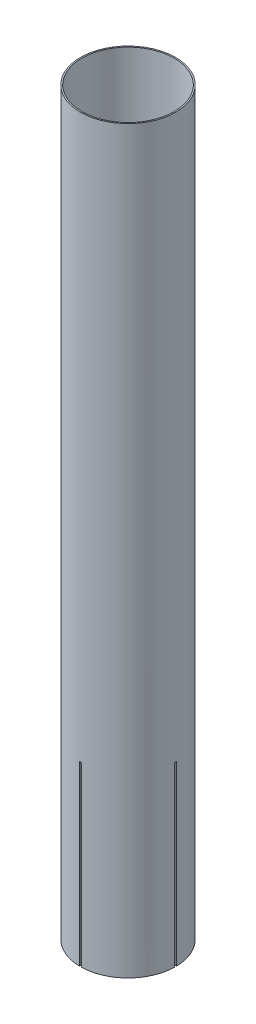
ISO-10303-21;
HEADER;
FILE_DESCRIPTION(('STEP AP214'),'2;1');
FILE_NAME('part.step','',(''),(''),'','','');
FILE_SCHEMA(('AUTOMOTIVE_DESIGN { 1 0 10303 214 1 1 1 1 }'));
ENDSEC;
DATA;
#1=APPLICATION_CONTEXT('core data for automotive mechanical design processes');
#2=APPLICATION_PROTOCOL_DEFINITION('international standard','automotive_design',2000,#1);
#3=PRODUCT_CONTEXT('',#1,'mechanical');
#4=PRODUCT('Part','Part','',(#3));
#5=PRODUCT_RELATED_PRODUCT_CATEGORY('part','',(#4));
#6=PRODUCT_DEFINITION_FORMATION('','',#4);
#7=PRODUCT_DEFINITION_CONTEXT('part definition',#1,'design');
#8=PRODUCT_DEFINITION('design','',#6,#7);
#9=PRODUCT_DEFINITION_SHAPE('','',#8);
#10=(LENGTH_UNIT() NAMED_UNIT(*) SI_UNIT(.MILLI.,.METRE.));
#11=(NAMED_UNIT(*) PLANE_ANGLE_UNIT() SI_UNIT($,.RADIAN.));
#12=(NAMED_UNIT(*) SI_UNIT($,.STERADIAN.) SOLID_ANGLE_UNIT());
#13=UNCERTAINTY_MEASURE_WITH_UNIT(LENGTH_MEASURE(1.E-05),#10,'distance_accuracy_value','');
#14=(GEOMETRIC_REPRESENTATION_CONTEXT(3) GLOBAL_UNCERTAINTY_ASSIGNED_CONTEXT((#13)) GLOBAL_UNIT_ASSIGNED_CONTEXT((#10,
#11,#12)) REPRESENTATION_CONTEXT('',''));
#15=CARTESIAN_POINT('',(0.,0.,0.));
#16=DIRECTION('',(0.,0.,1.));
#17=DIRECTION('',(1.,0.,0.));
#18=AXIS2_PLACEMENT_3D('',#15,#16,#17);
#19=CARTESIAN_POINT('',(0.,0.,0.));
#20=DIRECTION('',(0.,1.,0.));
#21=DIRECTION('',(0.,0.,1.));
#22=AXIS2_PLACEMENT_3D('',#19,#20,#21);
#23=PLANE('',#22);
#24=DIRECTION('',(1.,0.,0.));
#25=VECTOR('',#24,1.);
#26=CARTESIAN_POINT('',(-78.3590000000003,0.,-1.58750000000026));
#27=LINE('',#26,#25);
#28=CARTESIAN_POINT('',(-78.3429175149228,2.22044604925031E-13,-1.58750000000026));
#29=VERTEX_POINT('',#28);
#30=CARTESIAN_POINT('',(-76.1834617469566,2.22044604925031E-13,-1.58750000000025));
#31=VERTEX_POINT('',#30);
#32=EDGE_CURVE('E259',#29,#31,#27,.T.);
#33=ORIENTED_EDGE('',*,*,#32,.F.);
#34=CARTESIAN_POINT('',(0.,0.,0.));
#35=DIRECTION('',(0.,1.,0.));
#36=DIRECTION('',(0.,0.,1.));
#37=AXIS2_PLACEMENT_3D('',#34,#35,#36);
#38=CIRCLE('',#37,78.359);
#39=CARTESIAN_POINT('',(-1.58750000000002,0.,-78.3429175149228));
#40=VERTEX_POINT('',#39);
#41=EDGE_CURVE('E182',#40,#29,#38,.T.);
#42=ORIENTED_EDGE('',*,*,#41,.F.);
#43=DIRECTION('',(0.,0.,1.));
#44=VECTOR('',#43,1.);
#45=CARTESIAN_POINT('',(-1.58750000000002,0.,-78.359));
#46=LINE('',#45,#44);
#47=CARTESIAN_POINT('',(-1.58750000000002,0.,-76.1834617469566));
#48=VERTEX_POINT('',#47);
#49=EDGE_CURVE('E332',#40,#48,#46,.T.);
#50=ORIENTED_EDGE('',*,*,#49,.T.);
#51=CARTESIAN_POINT('',(0.,0.,0.));
#52=DIRECTION('',(0.,1.,0.));
#53=DIRECTION('',(0.,0.,1.));
#54=AXIS2_PLACEMENT_3D('',#51,#52,#53);
#55=CIRCLE('',#54,76.2);
#56=EDGE_CURVE('E322',#48,#31,#55,.T.);
#57=ORIENTED_EDGE('',*,*,#56,.T.);
#58=EDGE_LOOP('',(#33,#42,#50,#57));
#59=FACE_BOUND('',#58,.T.);
#60=ADVANCED_FACE('F41',(#59),#23,.F.);
#61=DIRECTION('',(1.,0.,0.));
#62=VECTOR('',#61,1.);
#63=CARTESIAN_POINT('',(-78.3590000000003,0.,1.58749999999974));
#64=LINE('',#63,#62);
#65=CARTESIAN_POINT('',(76.1834617469566,2.22044604925031E-13,1.58750000000028));
#66=VERTEX_POINT('',#65);
#67=CARTESIAN_POINT('',(78.3429175149228,2.22044604925031E-13,1.58750000000029));
#68=VERTEX_POINT('',#67);
#69=EDGE_CURVE('E249',#66,#68,#64,.T.);
#70=ORIENTED_EDGE('',*,*,#69,.T.);
#71=CARTESIAN_POINT('',(1.58750000000002,0.,78.3429175149228));
#72=VERTEX_POINT('',#71);
#73=EDGE_CURVE('E181',#72,#68,#38,.T.);
#74=ORIENTED_EDGE('',*,*,#73,.F.);
#75=DIRECTION('',(0.,0.,-1.));
#76=VECTOR('',#75,1.);
#77=CARTESIAN_POINT('',(1.58750000000002,0.,78.359));
#78=LINE('',#77,#76);
#79=CARTESIAN_POINT('',(1.58750000000002,0.,76.1834617469566));
#80=VERTEX_POINT('',#79);
#81=EDGE_CURVE('E285',#72,#80,#78,.T.);
#82=ORIENTED_EDGE('',*,*,#81,.T.);
#83=EDGE_CURVE('E315',#80,#66,#55,.T.);
#84=ORIENTED_EDGE('',*,*,#83,.T.);
#85=EDGE_LOOP('',(#70,#74,#82,#84));
#86=FACE_BOUND('',#85,.T.);
#87=ADVANCED_FACE('F374',(#86),#23,.F.);
#88=CARTESIAN_POINT('',(-78.3429175149228,2.22044604925031E-13,1.58749999999974));
#89=VERTEX_POINT('',#88);
#90=CARTESIAN_POINT('',(-76.1834617469566,2.22044604925031E-13,1.58749999999975));
#91=VERTEX_POINT('',#90);
#92=EDGE_CURVE('E254',#89,#91,#64,.T.);
#93=ORIENTED_EDGE('',*,*,#92,.T.);
#94=CARTESIAN_POINT('',(-1.58749999999998,0.,76.1834617469566));
#95=VERTEX_POINT('',#94);
#96=EDGE_CURVE('E311',#91,#95,#55,.T.);
#97=ORIENTED_EDGE('',*,*,#96,.T.);
#98=DIRECTION('',(0.,0.,-1.));
#99=VECTOR('',#98,1.);
#100=CARTESIAN_POINT('',(-1.58749999999998,0.,78.359));
#101=LINE('',#100,#99);
#102=CARTESIAN_POINT('',(-1.58749999999998,0.,78.3429175149228));
#103=VERTEX_POINT('',#102);
#104=EDGE_CURVE('E289',#103,#95,#101,.T.);
#105=ORIENTED_EDGE('',*,*,#104,.F.);
#106=EDGE_CURVE('E188',#89,#103,#38,.T.);
#107=ORIENTED_EDGE('',*,*,#106,.F.);
#108=EDGE_LOOP('',(#93,#97,#105,#107));
#109=FACE_BOUND('',#108,.T.);
#110=ADVANCED_FACE('F346',(#109),#23,.F.);
#111=DIRECTION('',(0.,0.,1.));
#112=VECTOR('',#111,1.);
#113=CARTESIAN_POINT('',(1.58749999999998,0.,-78.359));
#114=LINE('',#113,#112);
#115=CARTESIAN_POINT('',(1.58749999999998,0.,-78.3429175149228));
#116=VERTEX_POINT('',#115);
#117=CARTESIAN_POINT('',(1.58750000000036,0.,-76.1834617469566));
#118=VERTEX_POINT('',#117);
#119=EDGE_CURVE('E179',#116,#118,#114,.T.);
#120=ORIENTED_EDGE('',*,*,#119,.F.);
#121=CARTESIAN_POINT('',(78.3429175149228,0.,-1.5874999999992));
#122=VERTEX_POINT('',#121);
#123=EDGE_CURVE('E170',#122,#116,#38,.T.);
#124=ORIENTED_EDGE('',*,*,#123,.F.);
#125=DIRECTION('',(-1.,0.,0.));
#126=VECTOR('',#125,1.);
#127=CARTESIAN_POINT('',(78.3590000000008,0.,-1.5874999999992));
#128=LINE('',#127,#126);
#129=CARTESIAN_POINT('',(76.1834617469566,0.,-1.58749999999922));
#130=VERTEX_POINT('',#129);
#131=EDGE_CURVE('E153',#122,#130,#128,.T.);
#132=ORIENTED_EDGE('',*,*,#131,.T.);
#133=EDGE_CURVE('E318',#130,#118,#55,.T.);
#134=ORIENTED_EDGE('',*,*,#133,.T.);
#135=EDGE_LOOP('',(#120,#124,#132,#134));
#136=FACE_BOUND('',#135,.T.);
#137=ADVANCED_FACE('F178',(#136),#23,.F.);
#138=CARTESIAN_POINT('',(0.,1219.2,0.));
#139=DIRECTION('',(0.,-1.,0.));
#140=DIRECTION('',(0.,0.,-1.));
#141=AXIS2_PLACEMENT_3D('',#138,#139,#140);
#142=CYLINDRICAL_SURFACE('',#141,78.359);
#143=CARTESIAN_POINT('',(0.,1219.2,0.));
#144=DIRECTION('',(0.,1.,0.));
#145=DIRECTION('',(0.,0.,1.));
#146=AXIS2_PLACEMENT_3D('',#143,#144,#145);
#147=CIRCLE('',#146,78.359);
#148=CARTESIAN_POINT('',(0.,1219.2,78.359));
#149=VERTEX_POINT('',#148);
#150=EDGE_CURVE('E187',#149,#149,#147,.T.);
#151=ORIENTED_EDGE('',*,*,#150,.F.);
#152=EDGE_LOOP('',(#151));
#153=FACE_BOUND('',#152,.T.);
#154=DIRECTION('',(0.,-1.,0.));
#155=VECTOR('',#154,1.);
#156=CARTESIAN_POINT('',(-78.3429175149228,1219.2,1.58749999999937));
#157=LINE('',#156,#155);
#158=CARTESIAN_POINT('',(-78.3429175149228,292.1,1.58749999999965));
#159=VERTEX_POINT('',#158);
#160=EDGE_CURVE('E275',#89,#159,#157,.F.);
#161=ORIENTED_EDGE('',*,*,#160,.F.);
#162=ORIENTED_EDGE('',*,*,#106,.T.);
#163=DIRECTION('',(0.,-1.,0.));
#164=VECTOR('',#163,1.);
#165=CARTESIAN_POINT('',(-1.58750000000036,1219.2,78.3429175149228));
#166=LINE('',#165,#164);
#167=CARTESIAN_POINT('',(-1.58750000000007,292.1,78.3429175149228));
#168=VERTEX_POINT('',#167);
#169=EDGE_CURVE('E301',#168,#103,#166,.T.);
#170=ORIENTED_EDGE('',*,*,#169,.F.);
#171=CARTESIAN_POINT('',(0.,292.1,0.));
#172=DIRECTION('',(0.,-1.,0.));
#173=DIRECTION('',(0.,0.,-1.));
#174=AXIS2_PLACEMENT_3D('',#171,#172,#173);
#175=CIRCLE('',#174,78.359);
#176=CARTESIAN_POINT('',(1.58749999999993,292.1,78.3429175149228));
#177=VERTEX_POINT('',#176);
#178=EDGE_CURVE('E305',#177,#168,#175,.T.);
#179=ORIENTED_EDGE('',*,*,#178,.F.);
#180=DIRECTION('',(0.,-1.,0.));
#181=VECTOR('',#180,1.);
#182=CARTESIAN_POINT('',(1.58749999999964,1219.2,78.3429175149228));
#183=LINE('',#182,#181);
#184=EDGE_CURVE('E308',#72,#177,#183,.F.);
#185=ORIENTED_EDGE('',*,*,#184,.F.);
#186=ORIENTED_EDGE('',*,*,#73,.T.);
#187=DIRECTION('',(0.,-1.,0.));
#188=VECTOR('',#187,1.);
#189=CARTESIAN_POINT('',(78.3429175149228,1219.2,1.58749999999992));
#190=LINE('',#189,#188);
#191=CARTESIAN_POINT('',(78.3429175149228,292.1,1.5875000000002));
#192=VERTEX_POINT('',#191);
#193=EDGE_CURVE('E279',#192,#68,#190,.T.);
#194=ORIENTED_EDGE('',*,*,#193,.F.);
#195=CARTESIAN_POINT('',(0.,292.1,0.));
#196=DIRECTION('',(0.,-1.,0.));
#197=DIRECTION('',(0.,0.,-1.));
#198=AXIS2_PLACEMENT_3D('',#195,#196,#197);
#199=CIRCLE('',#198,78.359);
#200=CARTESIAN_POINT('',(78.3429175149228,292.1,-1.58749999999911));
#201=VERTEX_POINT('',#200);
#202=EDGE_CURVE('E172',#201,#192,#199,.T.);
#203=ORIENTED_EDGE('',*,*,#202,.F.);
#204=DIRECTION('',(0.,-1.,0.));
#205=VECTOR('',#204,1.);
#206=CARTESIAN_POINT('',(78.3429175149228,1219.2,-1.58749999999882));
#207=LINE('',#206,#205);
#208=EDGE_CURVE('E156',#122,#201,#207,.F.);
#209=ORIENTED_EDGE('',*,*,#208,.F.);
#210=ORIENTED_EDGE('',*,*,#123,.T.);
#211=DIRECTION('',(0.,-1.,0.));
#212=VECTOR('',#211,1.);
#213=CARTESIAN_POINT('',(1.58750000000036,1219.2,-78.3429175149228));
#214=LINE('',#213,#212);
#215=CARTESIAN_POINT('',(1.58750000000007,292.1,-78.3429175149228));
#216=VERTEX_POINT('',#215);
#217=EDGE_CURVE('E174',#216,#116,#214,.T.);
#218=ORIENTED_EDGE('',*,*,#217,.F.);
#219=CARTESIAN_POINT('',(-1.58749999999993,292.1,-78.3429175149228));
#220=VERTEX_POINT('',#219);
#221=EDGE_CURVE('E272',#220,#216,#199,.T.);
#222=ORIENTED_EDGE('',*,*,#221,.F.);
#223=DIRECTION('',(0.,-1.,0.));
#224=VECTOR('',#223,1.);
#225=CARTESIAN_POINT('',(-1.58749999999964,1219.2,-78.3429175149228));
#226=LINE('',#225,#224);
#227=EDGE_CURVE('E247',#40,#220,#226,.F.);
#228=ORIENTED_EDGE('',*,*,#227,.F.);
#229=ORIENTED_EDGE('',*,*,#41,.T.);
#230=DIRECTION('',(0.,-1.,0.));
#231=VECTOR('',#230,1.);
#232=CARTESIAN_POINT('',(-78.3429175149228,1219.2,-1.58750000000063));
#233=LINE('',#232,#231);
#234=CARTESIAN_POINT('',(-78.3429175149228,292.1,-1.58750000000034));
#235=VERTEX_POINT('',#234);
#236=EDGE_CURVE('E282',#235,#29,#233,.T.);
#237=ORIENTED_EDGE('',*,*,#236,.F.);
#238=EDGE_CURVE('E276',#159,#235,#199,.T.);
#239=ORIENTED_EDGE('',*,*,#238,.F.);
#240=EDGE_LOOP('',(#161,#162,#170,#179,#185,#186,#194,#203,#209,#210,#218,#222,#228,#229,#237,#239));
#241=FACE_BOUND('',#240,.T.);
#242=ADVANCED_FACE('F43',(#153,#241),#142,.T.);
#243=CARTESIAN_POINT('',(0.,1219.2,0.));
#244=DIRECTION('',(0.,-1.,0.));
#245=DIRECTION('',(0.,0.,-1.));
#246=AXIS2_PLACEMENT_3D('',#243,#244,#245);
#247=CYLINDRICAL_SURFACE('',#246,76.2);
#248=CARTESIAN_POINT('',(0.,1219.2,0.));
#249=DIRECTION('',(0.,1.,0.));
#250=DIRECTION('',(0.,0.,1.));
#251=AXIS2_PLACEMENT_3D('',#248,#249,#250);
#252=CIRCLE('',#251,76.2);
#253=CARTESIAN_POINT('',(0.,1219.2,76.2));
#254=VERTEX_POINT('',#253);
#255=EDGE_CURVE('E312',#254,#254,#252,.T.);
#256=ORIENTED_EDGE('',*,*,#255,.T.);
#257=EDGE_LOOP('',(#256));
#258=FACE_BOUND('',#257,.T.);
#259=CARTESIAN_POINT('',(0.,292.1,0.));
#260=DIRECTION('',(0.,-1.,0.));
#261=DIRECTION('',(0.,0.,-1.));
#262=AXIS2_PLACEMENT_3D('',#259,#260,#261);
#263=CIRCLE('',#262,76.2);
#264=CARTESIAN_POINT('',(-76.1834617469566,292.1,1.58749999999966));
#265=VERTEX_POINT('',#264);
#266=CARTESIAN_POINT('',(-76.1834617469566,292.1,-1.58750000000034));
#267=VERTEX_POINT('',#266);
#268=EDGE_CURVE('E212',#265,#267,#263,.T.);
#269=ORIENTED_EDGE('',*,*,#268,.T.);
#270=DIRECTION('',(0.,-1.,0.));
#271=VECTOR('',#270,1.);
#272=CARTESIAN_POINT('',(-76.1834617469566,1219.2,-1.58750000000062));
#273=LINE('',#272,#271);
#274=EDGE_CURVE('E11',#267,#31,#273,.T.);
#275=ORIENTED_EDGE('',*,*,#274,.T.);
#276=ORIENTED_EDGE('',*,*,#56,.F.);
#277=DIRECTION('',(0.,-1.,0.));
#278=VECTOR('',#277,1.);
#279=CARTESIAN_POINT('',(-1.58749999999964,1219.2,-76.1834617469566));
#280=LINE('',#279,#278);
#281=CARTESIAN_POINT('',(-1.58749999999993,292.1,-76.1834617469566));
#282=VERTEX_POINT('',#281);
#283=EDGE_CURVE('E221',#48,#282,#280,.F.);
#284=ORIENTED_EDGE('',*,*,#283,.T.);
#285=CARTESIAN_POINT('',(1.58750000000007,292.1,-76.1834617469566));
#286=VERTEX_POINT('',#285);
#287=EDGE_CURVE('E213',#282,#286,#263,.T.);
#288=ORIENTED_EDGE('',*,*,#287,.T.);
#289=DIRECTION('',(0.,-1.,0.));
#290=VECTOR('',#289,1.);
#291=CARTESIAN_POINT('',(1.58750000000036,1219.2,-76.1834617469566));
#292=LINE('',#291,#290);
#293=EDGE_CURVE('E217',#286,#118,#292,.T.);
#294=ORIENTED_EDGE('',*,*,#293,.T.);
#295=ORIENTED_EDGE('',*,*,#133,.F.);
#296=DIRECTION('',(0.,-1.,0.));
#297=VECTOR('',#296,1.);
#298=CARTESIAN_POINT('',(76.1834617469566,1219.2,-1.58749999999885));
#299=LINE('',#298,#297);
#300=CARTESIAN_POINT('',(76.1834617469566,292.1,-1.58749999999885));
#301=VERTEX_POINT('',#300);
#302=EDGE_CURVE('E158',#130,#301,#299,.F.);
#303=ORIENTED_EDGE('',*,*,#302,.T.);
#304=CARTESIAN_POINT('',(76.1834617469566,292.1,1.58750000000019));
#305=VERTEX_POINT('',#304);
#306=EDGE_CURVE('E207',#301,#305,#263,.T.);
#307=ORIENTED_EDGE('',*,*,#306,.T.);
#308=DIRECTION('',(0.,-1.,0.));
#309=VECTOR('',#308,1.);
#310=CARTESIAN_POINT('',(76.1834617469566,1219.2,1.58749999999991));
#311=LINE('',#310,#309);
#312=EDGE_CURVE('E211',#305,#66,#311,.T.);
#313=ORIENTED_EDGE('',*,*,#312,.T.);
#314=ORIENTED_EDGE('',*,*,#83,.F.);
#315=DIRECTION('',(0.,-1.,0.));
#316=VECTOR('',#315,1.);
#317=CARTESIAN_POINT('',(1.58749999999964,1219.2,76.1834617469566));
#318=LINE('',#317,#316);
#319=CARTESIAN_POINT('',(1.58749999999993,292.1,76.1834617469566));
#320=VERTEX_POINT('',#319);
#321=EDGE_CURVE('E201',#80,#320,#318,.F.);
#322=ORIENTED_EDGE('',*,*,#321,.T.);
#323=CARTESIAN_POINT('',(0.,292.1,0.));
#324=DIRECTION('',(0.,-1.,0.));
#325=DIRECTION('',(0.,0.,-1.));
#326=AXIS2_PLACEMENT_3D('',#323,#324,#325);
#327=CIRCLE('',#326,76.2);
#328=CARTESIAN_POINT('',(-1.58750000000007,292.1,76.1834617469566));
#329=VERTEX_POINT('',#328);
#330=EDGE_CURVE('E197',#320,#329,#327,.T.);
#331=ORIENTED_EDGE('',*,*,#330,.T.);
#332=DIRECTION('',(0.,-1.,0.));
#333=VECTOR('',#332,1.);
#334=CARTESIAN_POINT('',(-1.58750000000036,1219.2,76.1834617469566));
#335=LINE('',#334,#333);
#336=EDGE_CURVE('E193',#329,#95,#335,.T.);
#337=ORIENTED_EDGE('',*,*,#336,.T.);
#338=ORIENTED_EDGE('',*,*,#96,.F.);
#339=DIRECTION('',(0.,-1.,0.));
#340=VECTOR('',#339,1.);
#341=CARTESIAN_POINT('',(-76.1834617469566,1219.2,1.58749999999938));
#342=LINE('',#341,#340);
#343=EDGE_CURVE('E50',#91,#265,#342,.F.);
#344=ORIENTED_EDGE('',*,*,#343,.T.);
#345=EDGE_LOOP('',(#269,#275,#276,#284,#288,#294,#295,#303,#307,#313,#314,#322,#331,#337,#338,#344));
#346=FACE_BOUND('',#345,.T.);
#347=ADVANCED_FACE('F232',(#258,#346),#247,.F.);
#348=CARTESIAN_POINT('',(0.,1219.2,0.));
#349=DIRECTION('',(0.,1.,0.));
#350=DIRECTION('',(0.,0.,1.));
#351=AXIS2_PLACEMENT_3D('',#348,#349,#350);
#352=PLANE('',#351);
#353=ORIENTED_EDGE('',*,*,#150,.T.);
#354=EDGE_LOOP('',(#353));
#355=FACE_BOUND('',#354,.T.);
#356=ORIENTED_EDGE('',*,*,#255,.F.);
#357=EDGE_LOOP('',(#356));
#358=FACE_BOUND('',#357,.T.);
#359=ADVANCED_FACE('F423',(#355,#358),#352,.T.);
#360=CARTESIAN_POINT('',(1.58749999999993,292.1,78.359));
#361=DIRECTION('',(-1.,0.,0.));
#362=DIRECTION('',(0.,-1.,0.));
#363=AXIS2_PLACEMENT_3D('',#360,#361,#362);
#364=PLANE('',#363);
#365=ORIENTED_EDGE('',*,*,#184,.T.);
#366=DIRECTION('',(0.,0.,-1.));
#367=VECTOR('',#366,1.);
#368=CARTESIAN_POINT('',(1.58749999999993,292.1,78.359));
#369=LINE('',#368,#367);
#370=EDGE_CURVE('E297',#177,#320,#369,.T.);
#371=ORIENTED_EDGE('',*,*,#370,.T.);
#372=ORIENTED_EDGE('',*,*,#321,.F.);
#373=ORIENTED_EDGE('',*,*,#81,.F.);
#374=EDGE_LOOP('',(#365,#371,#372,#373));
#375=FACE_BOUND('',#374,.T.);
#376=ADVANCED_FACE('F414',(#375),#364,.T.);
#377=CARTESIAN_POINT('',(-1.58750000000007,292.1,78.359));
#378=DIRECTION('',(0.,-1.,0.));
#379=DIRECTION('',(0.,0.,-1.));
#380=AXIS2_PLACEMENT_3D('',#377,#378,#379);
#381=PLANE('',#380);
#382=ORIENTED_EDGE('',*,*,#178,.T.);
#383=DIRECTION('',(0.,0.,-1.));
#384=VECTOR('',#383,1.);
#385=CARTESIAN_POINT('',(-1.58750000000007,292.1,78.359));
#386=LINE('',#385,#384);
#387=EDGE_CURVE('E293',#168,#329,#386,.T.);
#388=ORIENTED_EDGE('',*,*,#387,.T.);
#389=ORIENTED_EDGE('',*,*,#330,.F.);
#390=ORIENTED_EDGE('',*,*,#370,.F.);
#391=EDGE_LOOP('',(#382,#388,#389,#390));
#392=FACE_BOUND('',#391,.T.);
#393=ADVANCED_FACE('F352',(#392),#381,.T.);
#394=CARTESIAN_POINT('',(-1.58750000000007,292.1,78.359));
#395=DIRECTION('',(1.,0.,0.));
#396=DIRECTION('',(0.,1.,0.));
#397=AXIS2_PLACEMENT_3D('',#394,#395,#396);
#398=PLANE('',#397);
#399=ORIENTED_EDGE('',*,*,#169,.T.);
#400=ORIENTED_EDGE('',*,*,#104,.T.);
#401=ORIENTED_EDGE('',*,*,#336,.F.);
#402=ORIENTED_EDGE('',*,*,#387,.F.);
#403=EDGE_LOOP('',(#399,#400,#401,#402));
#404=FACE_BOUND('',#403,.T.);
#405=ADVANCED_FACE('F349',(#404),#398,.T.);
#406=CARTESIAN_POINT('',(78.3590000000008,292.1,-1.58749999999911));
#407=DIRECTION('',(0.,0.,1.));
#408=DIRECTION('',(1.,0.,0.));
#409=AXIS2_PLACEMENT_3D('',#406,#407,#408);
#410=PLANE('',#409);
#411=ORIENTED_EDGE('',*,*,#208,.T.);
#412=DIRECTION('',(-1.,0.,0.));
#413=VECTOR('',#412,1.);
#414=CARTESIAN_POINT('',(78.3590000000008,292.1,-1.58749999999911));
#415=LINE('',#414,#413);
#416=EDGE_CURVE('E65',#201,#301,#415,.T.);
#417=ORIENTED_EDGE('',*,*,#416,.T.);
#418=ORIENTED_EDGE('',*,*,#302,.F.);
#419=ORIENTED_EDGE('',*,*,#131,.F.);
#420=EDGE_LOOP('',(#411,#417,#418,#419));
#421=FACE_BOUND('',#420,.T.);
#422=ADVANCED_FACE('F155',(#421),#410,.T.);
#423=CARTESIAN_POINT('',(-78.3590000000003,292.1,-1.58750000000035));
#424=DIRECTION('',(0.,-1.,0.));
#425=DIRECTION('',(0.,0.,-1.));
#426=AXIS2_PLACEMENT_3D('',#423,#424,#425);
#427=PLANE('',#426);
#428=ORIENTED_EDGE('',*,*,#202,.T.);
#429=DIRECTION('',(1.,0.,0.));
#430=VECTOR('',#429,1.);
#431=CARTESIAN_POINT('',(-78.3590000000003,292.1,1.58749999999965));
#432=LINE('',#431,#430);
#433=EDGE_CURVE('E264',#305,#192,#432,.T.);
#434=ORIENTED_EDGE('',*,*,#433,.F.);
#435=ORIENTED_EDGE('',*,*,#306,.F.);
#436=ORIENTED_EDGE('',*,*,#416,.F.);
#437=EDGE_LOOP('',(#428,#434,#435,#436));
#438=FACE_BOUND('',#437,.T.);
#439=ADVANCED_FACE('F367',(#438),#427,.T.);
#440=CARTESIAN_POINT('',(-78.3590000000003,292.1,1.58749999999965));
#441=DIRECTION('',(0.,0.,-1.));
#442=DIRECTION('',(-1.,0.,0.));
#443=AXIS2_PLACEMENT_3D('',#440,#441,#442);
#444=PLANE('',#443);
#445=ORIENTED_EDGE('',*,*,#193,.T.);
#446=ORIENTED_EDGE('',*,*,#69,.F.);
#447=ORIENTED_EDGE('',*,*,#312,.F.);
#448=ORIENTED_EDGE('',*,*,#433,.T.);
#449=EDGE_LOOP('',(#445,#446,#447,#448));
#450=FACE_BOUND('',#449,.T.);
#451=ADVANCED_FACE('F361',(#450),#444,.T.);
#452=CARTESIAN_POINT('',(1.58750000000007,292.1,-78.359));
#453=DIRECTION('',(-1.,0.,0.));
#454=DIRECTION('',(0.,-1.,0.));
#455=AXIS2_PLACEMENT_3D('',#452,#453,#454);
#456=PLANE('',#455);
#457=ORIENTED_EDGE('',*,*,#217,.T.);
#458=ORIENTED_EDGE('',*,*,#119,.T.);
#459=ORIENTED_EDGE('',*,*,#293,.F.);
#460=DIRECTION('',(0.,0.,1.));
#461=VECTOR('',#460,1.);
#462=CARTESIAN_POINT('',(1.58750000000007,292.1,-78.359));
#463=LINE('',#462,#461);
#464=EDGE_CURVE('E241',#216,#286,#463,.T.);
#465=ORIENTED_EDGE('',*,*,#464,.F.);
#466=EDGE_LOOP('',(#457,#458,#459,#465));
#467=FACE_BOUND('',#466,.T.);
#468=ADVANCED_FACE('F371',(#467),#456,.T.);
#469=CARTESIAN_POINT('',(-1.58749999999993,292.1,-78.359));
#470=DIRECTION('',(1.,0.,0.));
#471=DIRECTION('',(0.,1.,0.));
#472=AXIS2_PLACEMENT_3D('',#469,#470,#471);
#473=PLANE('',#472);
#474=ORIENTED_EDGE('',*,*,#227,.T.);
#475=DIRECTION('',(0.,0.,1.));
#476=VECTOR('',#475,1.);
#477=CARTESIAN_POINT('',(-1.58749999999993,292.1,-78.359));
#478=LINE('',#477,#476);
#479=EDGE_CURVE('E239',#220,#282,#478,.T.);
#480=ORIENTED_EDGE('',*,*,#479,.T.);
#481=ORIENTED_EDGE('',*,*,#283,.F.);
#482=ORIENTED_EDGE('',*,*,#49,.F.);
#483=EDGE_LOOP('',(#474,#480,#481,#482));
#484=FACE_BOUND('',#483,.T.);
#485=ADVANCED_FACE('F244',(#484),#473,.T.);
#486=ORIENTED_EDGE('',*,*,#221,.T.);
#487=ORIENTED_EDGE('',*,*,#464,.T.);
#488=ORIENTED_EDGE('',*,*,#287,.F.);
#489=ORIENTED_EDGE('',*,*,#479,.F.);
#490=EDGE_LOOP('',(#486,#487,#488,#489));
#491=FACE_BOUND('',#490,.T.);
#492=ADVANCED_FACE('F238',(#491),#427,.T.);
#493=CARTESIAN_POINT('',(-78.3590000000003,292.1,-1.58750000000035));
#494=DIRECTION('',(0.,0.,1.));
#495=DIRECTION('',(1.,0.,0.));
#496=AXIS2_PLACEMENT_3D('',#493,#494,#495);
#497=PLANE('',#496);
#498=ORIENTED_EDGE('',*,*,#236,.T.);
#499=ORIENTED_EDGE('',*,*,#32,.T.);
#500=ORIENTED_EDGE('',*,*,#274,.F.);
#501=DIRECTION('',(1.,0.,0.));
#502=VECTOR('',#501,1.);
#503=CARTESIAN_POINT('',(-78.3590000000003,292.1,-1.58750000000035));
#504=LINE('',#503,#502);
#505=EDGE_CURVE('E57',#235,#267,#504,.T.);
#506=ORIENTED_EDGE('',*,*,#505,.F.);
#507=EDGE_LOOP('',(#498,#499,#500,#506));
#508=FACE_BOUND('',#507,.T.);
#509=ADVANCED_FACE('F334',(#508),#497,.T.);
#510=ORIENTED_EDGE('',*,*,#160,.T.);
#511=EDGE_CURVE('E175',#159,#265,#432,.T.);
#512=ORIENTED_EDGE('',*,*,#511,.T.);
#513=ORIENTED_EDGE('',*,*,#343,.F.);
#514=ORIENTED_EDGE('',*,*,#92,.F.);
#515=EDGE_LOOP('',(#510,#512,#513,#514));
#516=FACE_BOUND('',#515,.T.);
#517=ADVANCED_FACE('F358',(#516),#444,.T.);
#518=ORIENTED_EDGE('',*,*,#238,.T.);
#519=ORIENTED_EDGE('',*,*,#505,.T.);
#520=ORIENTED_EDGE('',*,*,#268,.F.);
#521=ORIENTED_EDGE('',*,*,#511,.F.);
#522=EDGE_LOOP('',(#518,#519,#520,#521));
#523=FACE_BOUND('',#522,.T.);
#524=ADVANCED_FACE('F340',(#523),#427,.T.);
#525=CLOSED_SHELL('',(#60,#87,#110,#137,#242,#347,#359,#376,#393,#405,#422,#439,#451,#468,#485,
#492,#509,#517,#524));
#526=MANIFOLD_SOLID_BREP('B2',#525);
#527=ADVANCED_BREP_SHAPE_REPRESENTATION('',(#18,#526),#14);
#528=SHAPE_DEFINITION_REPRESENTATION(#9,#527);
ENDSEC;
END-ISO-10303-21;
